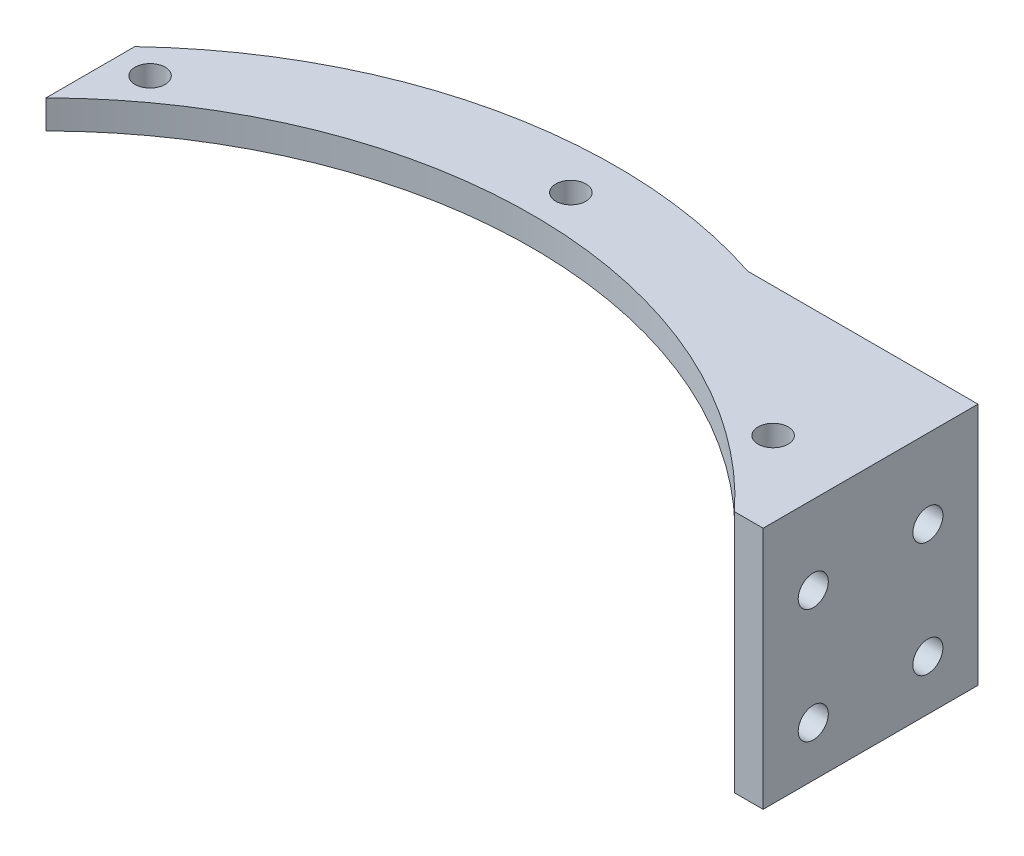
ISO-10303-21;
HEADER;
FILE_DESCRIPTION(('STEP AP214'),'2;1');
FILE_NAME('part.step','',(''),(''),'','','');
FILE_SCHEMA(('AUTOMOTIVE_DESIGN { 1 0 10303 214 1 1 1 1 }'));
ENDSEC;
DATA;
#1=APPLICATION_CONTEXT('core data for automotive mechanical design processes');
#2=APPLICATION_PROTOCOL_DEFINITION('international standard','automotive_design',2000,#1);
#3=PRODUCT_CONTEXT('',#1,'mechanical');
#4=PRODUCT('Part','Part','',(#3));
#5=PRODUCT_RELATED_PRODUCT_CATEGORY('part','',(#4));
#6=PRODUCT_DEFINITION_FORMATION('','',#4);
#7=PRODUCT_DEFINITION_CONTEXT('part definition',#1,'design');
#8=PRODUCT_DEFINITION('design','',#6,#7);
#9=PRODUCT_DEFINITION_SHAPE('','',#8);
#10=(LENGTH_UNIT() NAMED_UNIT(*) SI_UNIT(.MILLI.,.METRE.));
#11=(NAMED_UNIT(*) PLANE_ANGLE_UNIT() SI_UNIT($,.RADIAN.));
#12=(NAMED_UNIT(*) SI_UNIT($,.STERADIAN.) SOLID_ANGLE_UNIT());
#13=UNCERTAINTY_MEASURE_WITH_UNIT(LENGTH_MEASURE(1.E-05),#10,'distance_accuracy_value','');
#14=(GEOMETRIC_REPRESENTATION_CONTEXT(3) GLOBAL_UNCERTAINTY_ASSIGNED_CONTEXT((#13)) GLOBAL_UNIT_ASSIGNED_CONTEXT((#10,
#11,#12)) REPRESENTATION_CONTEXT('',''));
#15=CARTESIAN_POINT('',(0.,0.,0.));
#16=DIRECTION('',(0.,0.,1.));
#17=DIRECTION('',(1.,0.,0.));
#18=AXIS2_PLACEMENT_3D('',#15,#16,#17);
#19=CARTESIAN_POINT('',(67.2772143519415,4.,98.9897948556636));
#20=DIRECTION('',(0.,-1.,0.));
#21=DIRECTION('',(0.,0.,-1.));
#22=AXIS2_PLACEMENT_3D('',#19,#20,#21);
#23=PLANE('',#22);
#24=CARTESIAN_POINT('',(67.2772143519415,4.,98.9897948556636));
#25=DIRECTION('',(0.,-1.,0.));
#26=DIRECTION('',(0.,0.,-1.));
#27=AXIS2_PLACEMENT_3D('',#24,#25,#26);
#28=CIRCLE('',#27,68.2784360835126);
#29=CARTESIAN_POINT('',(19.1852220305643,4.,50.5222272607149));
#30=VERTEX_POINT('',#29);
#31=CARTESIAN_POINT('',(117.277214351941,4.,52.4930763261768));
#32=VERTEX_POINT('',#31);
#33=EDGE_CURVE('E81',#30,#32,#28,.T.);
#34=ORIENTED_EDGE('',*,*,#33,.T.);
#35=DIRECTION('',(-1.,0.,0.));
#36=VECTOR('',#35,1.);
#37=CARTESIAN_POINT('',(121.277214351941,4.,52.4930763261768));
#38=LINE('',#37,#36);
#39=CARTESIAN_POINT('',(121.277214351941,4.,52.4930763261768));
#40=VERTEX_POINT('',#39);
#41=EDGE_CURVE('E137',#40,#32,#38,.T.);
#42=ORIENTED_EDGE('',*,*,#41,.F.);
#43=DIRECTION('',(0.,0.,1.));
#44=VECTOR('',#43,1.);
#45=CARTESIAN_POINT('',(121.277214351941,4.,52.4930763261768));
#46=LINE('',#45,#44);
#47=CARTESIAN_POINT('',(121.277214351941,4.,22.4930763261768));
#48=VERTEX_POINT('',#47);
#49=EDGE_CURVE('E123',#48,#40,#46,.T.);
#50=ORIENTED_EDGE('',*,*,#49,.F.);
#51=DIRECTION('',(-1.,0.,0.));
#52=VECTOR('',#51,1.);
#53=CARTESIAN_POINT('',(117.277214351941,4.,22.4930763261768));
#54=LINE('',#53,#52);
#55=CARTESIAN_POINT('',(89.1446884815755,4.,22.4930763261768));
#56=VERTEX_POINT('',#55);
#57=EDGE_CURVE('E157',#48,#56,#54,.T.);
#58=ORIENTED_EDGE('',*,*,#57,.T.);
#59=CARTESIAN_POINT('',(67.2772143519415,4.,88.9897948556635));
#60=DIRECTION('',(0.,1.,0.));
#61=DIRECTION('',(0.,0.,-1.));
#62=AXIS2_PLACEMENT_3D('',#59,#60,#61);
#63=CIRCLE('',#62,70.);
#64=CARTESIAN_POINT('',(19.1852220305644,4.,38.1256594107294));
#65=VERTEX_POINT('',#64);
#66=EDGE_CURVE('E159',#56,#65,#63,.T.);
#67=ORIENTED_EDGE('',*,*,#66,.T.);
#68=DIRECTION('',(0.,0.,1.));
#69=VECTOR('',#68,1.);
#70=CARTESIAN_POINT('',(19.1852220305643,4.,38.1256594107294));
#71=LINE('',#70,#69);
#72=EDGE_CURVE('E52',#65,#30,#71,.T.);
#73=ORIENTED_EDGE('',*,*,#72,.T.);
#74=EDGE_LOOP('',(#34,#42,#50,#58,#67,#73));
#75=FACE_BOUND('',#74,.T.);
#76=CARTESIAN_POINT('',(67.2772143519415,4.,25.3366975702249));
#77=DIRECTION('',(0.,1.,0.));
#78=DIRECTION('',(0.,0.,1.));
#79=AXIS2_PLACEMENT_3D('',#76,#77,#78);
#80=CIRCLE('',#79,2.1);
#81=CARTESIAN_POINT('',(67.2772143519415,4.,27.4366975702249));
#82=VERTEX_POINT('',#81);
#83=EDGE_CURVE('E150',#82,#82,#80,.T.);
#84=ORIENTED_EDGE('',*,*,#83,.F.);
#85=EDGE_LOOP('',(#84));
#86=FACE_BOUND('',#85,.T.);
#87=CARTESIAN_POINT('',(23.7842627823707,4.,40.5901829349239));
#88=DIRECTION('',(0.,1.,0.));
#89=DIRECTION('',(0.,0.,1.));
#90=AXIS2_PLACEMENT_3D('',#87,#88,#89);
#91=CIRCLE('',#90,2.1);
#92=CARTESIAN_POINT('',(23.7842627823707,4.,42.6901829349239));
#93=VERTEX_POINT('',#92);
#94=EDGE_CURVE('E144',#93,#93,#91,.T.);
#95=ORIENTED_EDGE('',*,*,#94,.F.);
#96=EDGE_LOOP('',(#95));
#97=FACE_BOUND('',#96,.T.);
#98=CARTESIAN_POINT('',(110.770165921512,4.,40.5901829349239));
#99=DIRECTION('',(0.,1.,0.));
#100=DIRECTION('',(0.,0.,-1.));
#101=AXIS2_PLACEMENT_3D('',#98,#99,#100);
#102=CIRCLE('',#101,2.09999999999999);
#103=CARTESIAN_POINT('',(110.770165921512,4.,38.4901829349239));
#104=VERTEX_POINT('',#103);
#105=EDGE_CURVE('E135',#104,#104,#102,.T.);
#106=ORIENTED_EDGE('',*,*,#105,.F.);
#107=EDGE_LOOP('',(#106));
#108=FACE_BOUND('',#107,.T.);
#109=ADVANCED_FACE('F35',(#75,#86,#97,#108),#23,.F.);
#110=CARTESIAN_POINT('',(67.2772143519415,0.,98.9897948556636));
#111=DIRECTION('',(0.,-1.,0.));
#112=DIRECTION('',(0.,0.,-1.));
#113=AXIS2_PLACEMENT_3D('',#110,#111,#112);
#114=PLANE('',#113);
#115=CARTESIAN_POINT('',(23.7842627823707,0.,40.5901829349239));
#116=DIRECTION('',(0.,1.,0.));
#117=DIRECTION('',(0.,0.,1.));
#118=AXIS2_PLACEMENT_3D('',#115,#116,#117);
#119=CIRCLE('',#118,2.1);
#120=CARTESIAN_POINT('',(23.7842627823707,0.,42.6901829349239));
#121=VERTEX_POINT('',#120);
#122=EDGE_CURVE('E142',#121,#121,#119,.T.);
#123=ORIENTED_EDGE('',*,*,#122,.T.);
#124=EDGE_LOOP('',(#123));
#125=FACE_BOUND('',#124,.T.);
#126=CARTESIAN_POINT('',(67.2772143519415,0.,98.9897948556636));
#127=DIRECTION('',(0.,-1.,0.));
#128=DIRECTION('',(0.,0.,-1.));
#129=AXIS2_PLACEMENT_3D('',#126,#127,#128);
#130=CIRCLE('',#129,68.2784360835126);
#131=CARTESIAN_POINT('',(19.1852220305643,0.,50.5222272607149));
#132=VERTEX_POINT('',#131);
#133=CARTESIAN_POINT('',(117.277214351941,0.,52.4930763261768));
#134=VERTEX_POINT('',#133);
#135=EDGE_CURVE('E153',#132,#134,#130,.T.);
#136=ORIENTED_EDGE('',*,*,#135,.F.);
#137=DIRECTION('',(0.,0.,1.));
#138=VECTOR('',#137,1.);
#139=CARTESIAN_POINT('',(19.1852220305643,0.,38.1256594107294));
#140=LINE('',#139,#138);
#141=CARTESIAN_POINT('',(19.1852220305644,0.,38.1256594107294));
#142=VERTEX_POINT('',#141);
#143=EDGE_CURVE('E76',#142,#132,#140,.T.);
#144=ORIENTED_EDGE('',*,*,#143,.F.);
#145=CARTESIAN_POINT('',(67.2772143519415,0.,88.9897948556635));
#146=DIRECTION('',(0.,1.,0.));
#147=DIRECTION('',(0.,0.,-1.));
#148=AXIS2_PLACEMENT_3D('',#145,#146,#147);
#149=CIRCLE('',#148,70.);
#150=CARTESIAN_POINT('',(89.1446884815755,0.,22.4930763261768));
#151=VERTEX_POINT('',#150);
#152=EDGE_CURVE('E70',#151,#142,#149,.T.);
#153=ORIENTED_EDGE('',*,*,#152,.F.);
#154=DIRECTION('',(-1.,0.,0.));
#155=VECTOR('',#154,1.);
#156=CARTESIAN_POINT('',(117.277214351941,0.,22.4930763261768));
#157=LINE('',#156,#155);
#158=CARTESIAN_POINT('',(117.277214351941,0.,22.4930763261768));
#159=VERTEX_POINT('',#158);
#160=EDGE_CURVE('E168',#159,#151,#157,.T.);
#161=ORIENTED_EDGE('',*,*,#160,.F.);
#162=DIRECTION('',(0.,0.,-1.));
#163=VECTOR('',#162,1.);
#164=CARTESIAN_POINT('',(117.277214351941,0.,52.4930763261768));
#165=LINE('',#164,#163);
#166=EDGE_CURVE('E165',#134,#159,#165,.T.);
#167=ORIENTED_EDGE('',*,*,#166,.F.);
#168=EDGE_LOOP('',(#136,#144,#153,#161,#167));
#169=FACE_BOUND('',#168,.T.);
#170=CARTESIAN_POINT('',(67.2772143519415,0.,25.3366975702249));
#171=DIRECTION('',(0.,1.,0.));
#172=DIRECTION('',(0.,0.,1.));
#173=AXIS2_PLACEMENT_3D('',#170,#171,#172);
#174=CIRCLE('',#173,2.1);
#175=CARTESIAN_POINT('',(67.2772143519415,0.,27.4366975702249));
#176=VERTEX_POINT('',#175);
#177=EDGE_CURVE('E147',#176,#176,#174,.T.);
#178=ORIENTED_EDGE('',*,*,#177,.T.);
#179=EDGE_LOOP('',(#178));
#180=FACE_BOUND('',#179,.T.);
#181=CARTESIAN_POINT('',(110.770165921512,0.,40.5901829349239));
#182=DIRECTION('',(0.,1.,0.));
#183=DIRECTION('',(0.,0.,-1.));
#184=AXIS2_PLACEMENT_3D('',#181,#182,#183);
#185=CIRCLE('',#184,2.09999999999999);
#186=CARTESIAN_POINT('',(110.770165921512,0.,38.4901829349239));
#187=VERTEX_POINT('',#186);
#188=EDGE_CURVE('E132',#187,#187,#185,.T.);
#189=ORIENTED_EDGE('',*,*,#188,.T.);
#190=EDGE_LOOP('',(#189));
#191=FACE_BOUND('',#190,.T.);
#192=ADVANCED_FACE('F180',(#125,#169,#180,#191),#114,.T.);
#193=CARTESIAN_POINT('',(67.2772143519415,4.,98.9897948556636));
#194=DIRECTION('',(0.,-1.,0.));
#195=DIRECTION('',(0.,0.,-1.));
#196=AXIS2_PLACEMENT_3D('',#193,#194,#195);
#197=CYLINDRICAL_SURFACE('',#196,68.2784360835126);
#198=ORIENTED_EDGE('',*,*,#135,.T.);
#199=DIRECTION('',(0.,-1.,0.));
#200=VECTOR('',#199,1.);
#201=CARTESIAN_POINT('',(117.277214351941,4.,52.4930763261768));
#202=LINE('',#201,#200);
#203=EDGE_CURVE('E11',#32,#134,#202,.T.);
#204=ORIENTED_EDGE('',*,*,#203,.F.);
#205=ORIENTED_EDGE('',*,*,#33,.F.);
#206=DIRECTION('',(0.,-1.,0.));
#207=VECTOR('',#206,1.);
#208=CARTESIAN_POINT('',(19.1852220305643,4.,50.5222272607149));
#209=LINE('',#208,#207);
#210=EDGE_CURVE('E162',#30,#132,#209,.T.);
#211=ORIENTED_EDGE('',*,*,#210,.T.);
#212=EDGE_LOOP('',(#198,#204,#205,#211));
#213=FACE_BOUND('',#212,.T.);
#214=ADVANCED_FACE('F37',(#213),#197,.F.);
#215=CARTESIAN_POINT('',(117.277214351941,4.,22.4930763261768));
#216=DIRECTION('',(0.,0.,1.));
#217=DIRECTION('',(1.,0.,0.));
#218=AXIS2_PLACEMENT_3D('',#215,#216,#217);
#219=PLANE('',#218);
#220=ORIENTED_EDGE('',*,*,#160,.T.);
#221=DIRECTION('',(0.,-1.,0.));
#222=VECTOR('',#221,1.);
#223=CARTESIAN_POINT('',(89.1446884815755,4.,22.4930763261768));
#224=LINE('',#223,#222);
#225=EDGE_CURVE('E44',#56,#151,#224,.T.);
#226=ORIENTED_EDGE('',*,*,#225,.F.);
#227=ORIENTED_EDGE('',*,*,#57,.F.);
#228=DIRECTION('',(0.,1.,0.));
#229=VECTOR('',#228,1.);
#230=CARTESIAN_POINT('',(121.277214351941,4.,22.4930763261768));
#231=LINE('',#230,#229);
#232=CARTESIAN_POINT('',(121.277214351941,-30.,22.4930763261768));
#233=VERTEX_POINT('',#232);
#234=EDGE_CURVE('E117',#233,#48,#231,.T.);
#235=ORIENTED_EDGE('',*,*,#234,.F.);
#236=DIRECTION('',(-1.,0.,0.));
#237=VECTOR('',#236,1.);
#238=CARTESIAN_POINT('',(121.277214351941,-30.,22.4930763261768));
#239=LINE('',#238,#237);
#240=CARTESIAN_POINT('',(117.277214351941,-30.,22.4930763261768));
#241=VERTEX_POINT('',#240);
#242=EDGE_CURVE('E113',#233,#241,#239,.T.);
#243=ORIENTED_EDGE('',*,*,#242,.T.);
#244=DIRECTION('',(0.,1.,0.));
#245=VECTOR('',#244,1.);
#246=CARTESIAN_POINT('',(117.277214351941,4.,22.4930763261768));
#247=LINE('',#246,#245);
#248=EDGE_CURVE('E126',#241,#159,#247,.T.);
#249=ORIENTED_EDGE('',*,*,#248,.T.);
#250=EDGE_LOOP('',(#220,#226,#227,#235,#243,#249));
#251=FACE_BOUND('',#250,.T.);
#252=ADVANCED_FACE('F262',(#251),#219,.F.);
#253=CARTESIAN_POINT('',(67.2772143519415,4.,88.9897948556635));
#254=DIRECTION('',(0.,-1.,0.));
#255=DIRECTION('',(0.,0.,-1.));
#256=AXIS2_PLACEMENT_3D('',#253,#254,#255);
#257=CYLINDRICAL_SURFACE('',#256,70.);
#258=ORIENTED_EDGE('',*,*,#152,.T.);
#259=DIRECTION('',(0.,-1.,0.));
#260=VECTOR('',#259,1.);
#261=CARTESIAN_POINT('',(19.1852220305644,4.,38.1256594107294));
#262=LINE('',#261,#260);
#263=EDGE_CURVE('E173',#65,#142,#262,.T.);
#264=ORIENTED_EDGE('',*,*,#263,.F.);
#265=ORIENTED_EDGE('',*,*,#66,.F.);
#266=ORIENTED_EDGE('',*,*,#225,.T.);
#267=EDGE_LOOP('',(#258,#264,#265,#266));
#268=FACE_BOUND('',#267,.T.);
#269=ADVANCED_FACE('F176',(#268),#257,.T.);
#270=CARTESIAN_POINT('',(19.1852220305643,4.,38.1256594107294));
#271=DIRECTION('',(1.,0.,0.));
#272=DIRECTION('',(0.,0.,-1.));
#273=AXIS2_PLACEMENT_3D('',#270,#271,#272);
#274=PLANE('',#273);
#275=ORIENTED_EDGE('',*,*,#143,.T.);
#276=ORIENTED_EDGE('',*,*,#210,.F.);
#277=ORIENTED_EDGE('',*,*,#72,.F.);
#278=ORIENTED_EDGE('',*,*,#263,.T.);
#279=EDGE_LOOP('',(#275,#276,#277,#278));
#280=FACE_BOUND('',#279,.T.);
#281=ADVANCED_FACE('F258',(#280),#274,.F.);
#282=CARTESIAN_POINT('',(67.2772143519415,4.,25.3366975702249));
#283=DIRECTION('',(0.,-1.,0.));
#284=DIRECTION('',(0.,0.,-1.));
#285=AXIS2_PLACEMENT_3D('',#282,#283,#284);
#286=CYLINDRICAL_SURFACE('',#285,2.1);
#287=ORIENTED_EDGE('',*,*,#83,.T.);
#288=EDGE_LOOP('',(#287));
#289=FACE_BOUND('',#288,.T.);
#290=ORIENTED_EDGE('',*,*,#177,.F.);
#291=EDGE_LOOP('',(#290));
#292=FACE_BOUND('',#291,.T.);
#293=ADVANCED_FACE('F255',(#289,#292),#286,.F.);
#294=CARTESIAN_POINT('',(23.7842627823707,4.,40.5901829349239));
#295=DIRECTION('',(0.,-1.,0.));
#296=DIRECTION('',(0.,0.,-1.));
#297=AXIS2_PLACEMENT_3D('',#294,#295,#296);
#298=CYLINDRICAL_SURFACE('',#297,2.1);
#299=ORIENTED_EDGE('',*,*,#94,.T.);
#300=EDGE_LOOP('',(#299));
#301=FACE_BOUND('',#300,.T.);
#302=ORIENTED_EDGE('',*,*,#122,.F.);
#303=EDGE_LOOP('',(#302));
#304=FACE_BOUND('',#303,.T.);
#305=ADVANCED_FACE('F288',(#301,#304),#298,.F.);
#306=CARTESIAN_POINT('',(110.770165921512,4.,40.5901829349239));
#307=DIRECTION('',(0.,-1.,0.));
#308=DIRECTION('',(0.,0.,-1.));
#309=AXIS2_PLACEMENT_3D('',#306,#307,#308);
#310=CYLINDRICAL_SURFACE('',#309,2.09999999999999);
#311=ORIENTED_EDGE('',*,*,#105,.T.);
#312=EDGE_LOOP('',(#311));
#313=FACE_BOUND('',#312,.T.);
#314=ORIENTED_EDGE('',*,*,#188,.F.);
#315=EDGE_LOOP('',(#314));
#316=FACE_BOUND('',#315,.T.);
#317=ADVANCED_FACE('F231',(#313,#316),#310,.F.);
#318=CARTESIAN_POINT('',(117.277214351941,0.,0.));
#319=DIRECTION('',(1.,0.,0.));
#320=DIRECTION('',(0.,0.,-1.));
#321=AXIS2_PLACEMENT_3D('',#318,#319,#320);
#322=PLANE('',#321);
#323=CARTESIAN_POINT('',(117.277214351941,-23.0009132291257,29.4921630970512));
#324=DIRECTION('',(-1.,0.,0.));
#325=DIRECTION('',(0.,0.,1.));
#326=AXIS2_PLACEMENT_3D('',#323,#324,#325);
#327=CIRCLE('',#326,2.10000000000001);
#328=CARTESIAN_POINT('',(117.277214351941,-23.0009132291257,31.5921630970512));
#329=VERTEX_POINT('',#328);
#330=EDGE_CURVE('E201',#329,#329,#327,.T.);
#331=ORIENTED_EDGE('',*,*,#330,.F.);
#332=EDGE_LOOP('',(#331));
#333=FACE_BOUND('',#332,.T.);
#334=CARTESIAN_POINT('',(117.277214351941,-23.0009132291256,45.4939895553028));
#335=DIRECTION('',(-1.,0.,0.));
#336=DIRECTION('',(0.,0.,1.));
#337=AXIS2_PLACEMENT_3D('',#334,#335,#336);
#338=CIRCLE('',#337,2.10000000000001);
#339=CARTESIAN_POINT('',(117.277214351941,-23.0009132291256,47.5939895553028));
#340=VERTEX_POINT('',#339);
#341=EDGE_CURVE('E207',#340,#340,#338,.T.);
#342=ORIENTED_EDGE('',*,*,#341,.F.);
#343=EDGE_LOOP('',(#342));
#344=FACE_BOUND('',#343,.T.);
#345=CARTESIAN_POINT('',(117.277214351941,-6.99908677087401,45.4939895553026));
#346=DIRECTION('',(-1.,0.,0.));
#347=DIRECTION('',(0.,0.,1.));
#348=AXIS2_PLACEMENT_3D('',#345,#346,#347);
#349=CIRCLE('',#348,2.1);
#350=CARTESIAN_POINT('',(117.277214351941,-6.99908677087401,47.5939895553026));
#351=VERTEX_POINT('',#350);
#352=EDGE_CURVE('E213',#351,#351,#349,.T.);
#353=ORIENTED_EDGE('',*,*,#352,.F.);
#354=EDGE_LOOP('',(#353));
#355=FACE_BOUND('',#354,.T.);
#356=CARTESIAN_POINT('',(117.277214351941,-6.99908677087423,29.492163097051));
#357=DIRECTION('',(-1.,0.,0.));
#358=DIRECTION('',(0.,0.,1.));
#359=AXIS2_PLACEMENT_3D('',#356,#357,#358);
#360=CIRCLE('',#359,2.1);
#361=CARTESIAN_POINT('',(117.277214351941,-6.99908677087423,31.592163097051));
#362=VERTEX_POINT('',#361);
#363=EDGE_CURVE('E195',#362,#362,#360,.T.);
#364=ORIENTED_EDGE('',*,*,#363,.F.);
#365=EDGE_LOOP('',(#364));
#366=FACE_BOUND('',#365,.T.);
#367=DIRECTION('',(0.,-1.,0.));
#368=VECTOR('',#367,1.);
#369=CARTESIAN_POINT('',(117.277214351941,4.,52.4930763261768));
#370=LINE('',#369,#368);
#371=CARTESIAN_POINT('',(117.277214351941,-30.,52.4930763261768));
#372=VERTEX_POINT('',#371);
#373=EDGE_CURVE('E130',#134,#372,#370,.T.);
#374=ORIENTED_EDGE('',*,*,#373,.F.);
#375=ORIENTED_EDGE('',*,*,#166,.T.);
#376=ORIENTED_EDGE('',*,*,#248,.F.);
#377=DIRECTION('',(0.,0.,-1.));
#378=VECTOR('',#377,1.);
#379=CARTESIAN_POINT('',(117.277214351941,-30.,52.4930763261768));
#380=LINE('',#379,#378);
#381=EDGE_CURVE('E187',#372,#241,#380,.T.);
#382=ORIENTED_EDGE('',*,*,#381,.F.);
#383=EDGE_LOOP('',(#374,#375,#376,#382));
#384=FACE_BOUND('',#383,.T.);
#385=ADVANCED_FACE('F184',(#333,#344,#355,#366,#384),#322,.F.);
#386=CARTESIAN_POINT('',(121.277214351941,4.,52.4930763261768));
#387=DIRECTION('',(0.,0.,-1.));
#388=DIRECTION('',(-1.,0.,0.));
#389=AXIS2_PLACEMENT_3D('',#386,#387,#388);
#390=PLANE('',#389);
#391=ORIENTED_EDGE('',*,*,#203,.T.);
#392=ORIENTED_EDGE('',*,*,#373,.T.);
#393=DIRECTION('',(-1.,0.,0.));
#394=VECTOR('',#393,1.);
#395=CARTESIAN_POINT('',(121.277214351941,-30.,52.4930763261768));
#396=LINE('',#395,#394);
#397=CARTESIAN_POINT('',(121.277214351941,-30.,52.4930763261768));
#398=VERTEX_POINT('',#397);
#399=EDGE_CURVE('E111',#398,#372,#396,.T.);
#400=ORIENTED_EDGE('',*,*,#399,.F.);
#401=DIRECTION('',(0.,-1.,0.));
#402=VECTOR('',#401,1.);
#403=CARTESIAN_POINT('',(121.277214351941,4.,52.4930763261768));
#404=LINE('',#403,#402);
#405=EDGE_CURVE('E118',#40,#398,#404,.T.);
#406=ORIENTED_EDGE('',*,*,#405,.F.);
#407=ORIENTED_EDGE('',*,*,#41,.T.);
#408=EDGE_LOOP('',(#391,#392,#400,#406,#407));
#409=FACE_BOUND('',#408,.T.);
#410=ADVANCED_FACE('F128',(#409),#390,.F.);
#411=CARTESIAN_POINT('',(121.277214351941,-30.,52.4930763261768));
#412=DIRECTION('',(0.,1.,0.));
#413=DIRECTION('',(0.,0.,1.));
#414=AXIS2_PLACEMENT_3D('',#411,#412,#413);
#415=PLANE('',#414);
#416=ORIENTED_EDGE('',*,*,#381,.T.);
#417=ORIENTED_EDGE('',*,*,#242,.F.);
#418=DIRECTION('',(0.,0.,-1.));
#419=VECTOR('',#418,1.);
#420=CARTESIAN_POINT('',(121.277214351941,-30.,52.4930763261768));
#421=LINE('',#420,#419);
#422=EDGE_CURVE('E107',#398,#233,#421,.T.);
#423=ORIENTED_EDGE('',*,*,#422,.F.);
#424=ORIENTED_EDGE('',*,*,#399,.T.);
#425=EDGE_LOOP('',(#416,#417,#423,#424));
#426=FACE_BOUND('',#425,.T.);
#427=ADVANCED_FACE('F109',(#426),#415,.F.);
#428=CARTESIAN_POINT('',(121.277214351941,0.,0.));
#429=DIRECTION('',(1.,0.,0.));
#430=DIRECTION('',(0.,0.,-1.));
#431=AXIS2_PLACEMENT_3D('',#428,#429,#430);
#432=PLANE('',#431);
#433=CARTESIAN_POINT('',(121.277214351941,-23.0009132291257,29.4921630970512));
#434=DIRECTION('',(-1.,0.,0.));
#435=DIRECTION('',(0.,0.,1.));
#436=AXIS2_PLACEMENT_3D('',#433,#434,#435);
#437=CIRCLE('',#436,2.10000000000001);
#438=CARTESIAN_POINT('',(121.277214351941,-23.0009132291257,31.5921630970512));
#439=VERTEX_POINT('',#438);
#440=EDGE_CURVE('E204',#439,#439,#437,.T.);
#441=ORIENTED_EDGE('',*,*,#440,.T.);
#442=EDGE_LOOP('',(#441));
#443=FACE_BOUND('',#442,.T.);
#444=CARTESIAN_POINT('',(121.277214351941,-23.0009132291256,45.4939895553028));
#445=DIRECTION('',(-1.,0.,0.));
#446=DIRECTION('',(0.,0.,1.));
#447=AXIS2_PLACEMENT_3D('',#444,#445,#446);
#448=CIRCLE('',#447,2.10000000000001);
#449=CARTESIAN_POINT('',(121.277214351941,-23.0009132291256,47.5939895553028));
#450=VERTEX_POINT('',#449);
#451=EDGE_CURVE('E210',#450,#450,#448,.T.);
#452=ORIENTED_EDGE('',*,*,#451,.T.);
#453=EDGE_LOOP('',(#452));
#454=FACE_BOUND('',#453,.T.);
#455=CARTESIAN_POINT('',(121.277214351941,-6.99908677087401,45.4939895553026));
#456=DIRECTION('',(-1.,0.,0.));
#457=DIRECTION('',(0.,0.,1.));
#458=AXIS2_PLACEMENT_3D('',#455,#456,#457);
#459=CIRCLE('',#458,2.1);
#460=CARTESIAN_POINT('',(121.277214351941,-6.99908677087401,47.5939895553026));
#461=VERTEX_POINT('',#460);
#462=EDGE_CURVE('E198',#461,#461,#459,.T.);
#463=ORIENTED_EDGE('',*,*,#462,.T.);
#464=EDGE_LOOP('',(#463));
#465=FACE_BOUND('',#464,.T.);
#466=CARTESIAN_POINT('',(121.277214351941,-6.99908677087423,29.492163097051));
#467=DIRECTION('',(-1.,0.,0.));
#468=DIRECTION('',(0.,0.,1.));
#469=AXIS2_PLACEMENT_3D('',#466,#467,#468);
#470=CIRCLE('',#469,2.1);
#471=CARTESIAN_POINT('',(121.277214351941,-6.99908677087423,31.592163097051));
#472=VERTEX_POINT('',#471);
#473=EDGE_CURVE('E188',#472,#472,#470,.T.);
#474=ORIENTED_EDGE('',*,*,#473,.T.);
#475=EDGE_LOOP('',(#474));
#476=FACE_BOUND('',#475,.T.);
#477=ORIENTED_EDGE('',*,*,#405,.T.);
#478=ORIENTED_EDGE('',*,*,#422,.T.);
#479=ORIENTED_EDGE('',*,*,#234,.T.);
#480=ORIENTED_EDGE('',*,*,#49,.T.);
#481=EDGE_LOOP('',(#477,#478,#479,#480));
#482=FACE_BOUND('',#481,.T.);
#483=ADVANCED_FACE('F121',(#443,#454,#465,#476,#482),#432,.T.);
#484=CARTESIAN_POINT('',(121.277214351941,-6.99908677087423,29.492163097051));
#485=DIRECTION('',(-1.,0.,0.));
#486=DIRECTION('',(0.,0.,1.));
#487=AXIS2_PLACEMENT_3D('',#484,#485,#486);
#488=CYLINDRICAL_SURFACE('',#487,2.1);
#489=ORIENTED_EDGE('',*,*,#473,.F.);
#490=EDGE_LOOP('',(#489));
#491=FACE_BOUND('',#490,.T.);
#492=ORIENTED_EDGE('',*,*,#363,.T.);
#493=EDGE_LOOP('',(#492));
#494=FACE_BOUND('',#493,.T.);
#495=ADVANCED_FACE('F225',(#491,#494),#488,.F.);
#496=CARTESIAN_POINT('',(121.277214351941,-6.99908677087401,45.4939895553026));
#497=DIRECTION('',(-1.,0.,0.));
#498=DIRECTION('',(0.,0.,1.));
#499=AXIS2_PLACEMENT_3D('',#496,#497,#498);
#500=CYLINDRICAL_SURFACE('',#499,2.1);
#501=ORIENTED_EDGE('',*,*,#462,.F.);
#502=EDGE_LOOP('',(#501));
#503=FACE_BOUND('',#502,.T.);
#504=ORIENTED_EDGE('',*,*,#352,.T.);
#505=EDGE_LOOP('',(#504));
#506=FACE_BOUND('',#505,.T.);
#507=ADVANCED_FACE('F221',(#503,#506),#500,.F.);
#508=CARTESIAN_POINT('',(121.277214351941,-23.0009132291256,45.4939895553028));
#509=DIRECTION('',(-1.,0.,0.));
#510=DIRECTION('',(0.,0.,1.));
#511=AXIS2_PLACEMENT_3D('',#508,#509,#510);
#512=CYLINDRICAL_SURFACE('',#511,2.10000000000001);
#513=ORIENTED_EDGE('',*,*,#451,.F.);
#514=EDGE_LOOP('',(#513));
#515=FACE_BOUND('',#514,.T.);
#516=ORIENTED_EDGE('',*,*,#341,.T.);
#517=EDGE_LOOP('',(#516));
#518=FACE_BOUND('',#517,.T.);
#519=ADVANCED_FACE('F224',(#515,#518),#512,.F.);
#520=CARTESIAN_POINT('',(121.277214351941,-23.0009132291257,29.4921630970512));
#521=DIRECTION('',(-1.,0.,0.));
#522=DIRECTION('',(0.,0.,1.));
#523=AXIS2_PLACEMENT_3D('',#520,#521,#522);
#524=CYLINDRICAL_SURFACE('',#523,2.10000000000001);
#525=ORIENTED_EDGE('',*,*,#440,.F.);
#526=EDGE_LOOP('',(#525));
#527=FACE_BOUND('',#526,.T.);
#528=ORIENTED_EDGE('',*,*,#330,.T.);
#529=EDGE_LOOP('',(#528));
#530=FACE_BOUND('',#529,.T.);
#531=ADVANCED_FACE('F368',(#527,#530),#524,.F.);
#532=CLOSED_SHELL('',(#109,#192,#214,#252,#269,#281,#293,#305,#317,#385,#410,#427,#483,#495,
#507,#519,#531));
#533=MANIFOLD_SOLID_BREP('B2',#532);
#534=ADVANCED_BREP_SHAPE_REPRESENTATION('',(#18,#533),#14);
#535=SHAPE_DEFINITION_REPRESENTATION(#9,#534);
ENDSEC;
END-ISO-10303-21;
